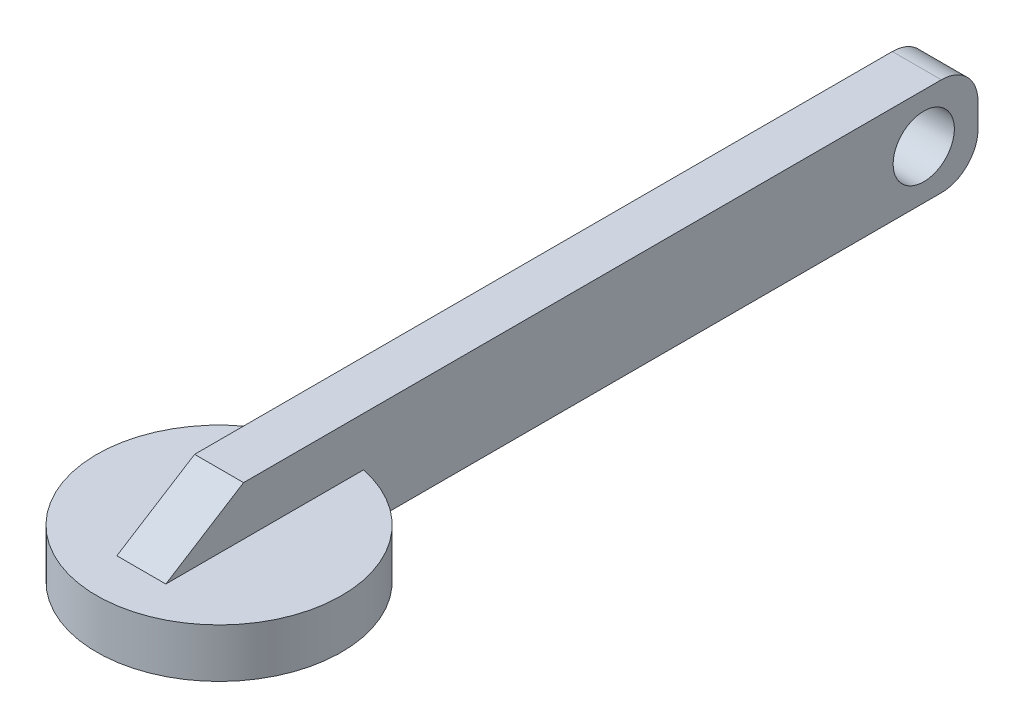
ISO-10303-21;
HEADER;
FILE_DESCRIPTION(('STEP AP214'),'2;1');
FILE_NAME('part.step','',(''),(''),'','','');
FILE_SCHEMA(('AUTOMOTIVE_DESIGN { 1 0 10303 214 1 1 1 1 }'));
ENDSEC;
DATA;
#1=APPLICATION_CONTEXT('core data for automotive mechanical design processes');
#2=APPLICATION_PROTOCOL_DEFINITION('international standard','automotive_design',2000,#1);
#3=PRODUCT_CONTEXT('',#1,'mechanical');
#4=PRODUCT('Part','Part','',(#3));
#5=PRODUCT_RELATED_PRODUCT_CATEGORY('part','',(#4));
#6=PRODUCT_DEFINITION_FORMATION('','',#4);
#7=PRODUCT_DEFINITION_CONTEXT('part definition',#1,'design');
#8=PRODUCT_DEFINITION('design','',#6,#7);
#9=PRODUCT_DEFINITION_SHAPE('','',#8);
#10=(LENGTH_UNIT() NAMED_UNIT(*) SI_UNIT(.MILLI.,.METRE.));
#11=(NAMED_UNIT(*) PLANE_ANGLE_UNIT() SI_UNIT($,.RADIAN.));
#12=(NAMED_UNIT(*) SI_UNIT($,.STERADIAN.) SOLID_ANGLE_UNIT());
#13=UNCERTAINTY_MEASURE_WITH_UNIT(LENGTH_MEASURE(1.E-05),#10,'distance_accuracy_value','');
#14=(GEOMETRIC_REPRESENTATION_CONTEXT(3) GLOBAL_UNCERTAINTY_ASSIGNED_CONTEXT((#13)) GLOBAL_UNIT_ASSIGNED_CONTEXT((#10,
#11,#12)) REPRESENTATION_CONTEXT('',''));
#15=CARTESIAN_POINT('',(0.,0.,0.));
#16=DIRECTION('',(0.,0.,1.));
#17=DIRECTION('',(1.,0.,0.));
#18=AXIS2_PLACEMENT_3D('',#15,#16,#17);
#19=CARTESIAN_POINT('',(2.,8.,30.));
#20=DIRECTION('',(-1.,0.,0.));
#21=DIRECTION('',(0.,0.,1.));
#22=AXIS2_PLACEMENT_3D('',#19,#20,#21);
#23=PLANE('',#22);
#24=CARTESIAN_POINT('',(2.,4.,-25.5675863562601));
#25=DIRECTION('',(-1.,0.,0.));
#26=DIRECTION('',(0.,0.,1.));
#27=AXIS2_PLACEMENT_3D('',#24,#25,#26);
#28=CIRCLE('',#27,2.5);
#29=CARTESIAN_POINT('',(2.,4.,-23.0675863562601));
#30=VERTEX_POINT('',#29);
#31=EDGE_CURVE('E139',#30,#30,#28,.T.);
#32=ORIENTED_EDGE('',*,*,#31,.T.);
#33=EDGE_LOOP('',(#32));
#34=FACE_BOUND('',#33,.T.);
#35=DIRECTION('',(0.,0.,1.));
#36=VECTOR('',#35,1.);
#37=CARTESIAN_POINT('',(2.,4.,30.));
#38=LINE('',#37,#36);
#39=CARTESIAN_POINT('',(2.,4.,20.2020410288673));
#40=VERTEX_POINT('',#39);
#41=CARTESIAN_POINT('',(2.,4.,36.3517218887459));
#42=VERTEX_POINT('',#41);
#43=EDGE_CURVE('E55',#40,#42,#38,.T.);
#44=ORIENTED_EDGE('',*,*,#43,.F.);
#45=DIRECTION('',(0.,-1.,0.));
#46=VECTOR('',#45,1.);
#47=CARTESIAN_POINT('',(2.,4.,20.2020410288673));
#48=LINE('',#47,#46);
#49=CARTESIAN_POINT('',(2.,0.,20.2020410288673));
#50=VERTEX_POINT('',#49);
#51=EDGE_CURVE('E132',#40,#50,#48,.T.);
#52=ORIENTED_EDGE('',*,*,#51,.T.);
#53=DIRECTION('',(0.,0.,-1.));
#54=VECTOR('',#53,1.);
#55=CARTESIAN_POINT('',(2.,0.,30.));
#56=LINE('',#55,#54);
#57=CARTESIAN_POINT('',(2.,0.,-27.));
#58=VERTEX_POINT('',#57);
#59=EDGE_CURVE('E142',#50,#58,#56,.T.);
#60=ORIENTED_EDGE('',*,*,#59,.T.);
#61=CARTESIAN_POINT('',(2.,3.,-27.));
#62=DIRECTION('',(-1.,0.,0.));
#63=DIRECTION('',(0.,0.,1.));
#64=AXIS2_PLACEMENT_3D('',#61,#62,#63);
#65=CIRCLE('',#64,3.);
#66=CARTESIAN_POINT('',(2.,3.,-30.));
#67=VERTEX_POINT('',#66);
#68=EDGE_CURVE('E162',#58,#67,#65,.F.);
#69=ORIENTED_EDGE('',*,*,#68,.T.);
#70=DIRECTION('',(0.,-1.,0.));
#71=VECTOR('',#70,1.);
#72=CARTESIAN_POINT('',(2.,8.,-30.));
#73=LINE('',#72,#71);
#74=CARTESIAN_POINT('',(2.,5.,-30.));
#75=VERTEX_POINT('',#74);
#76=EDGE_CURVE('E149',#75,#67,#73,.T.);
#77=ORIENTED_EDGE('',*,*,#76,.F.);
#78=CARTESIAN_POINT('',(2.,5.,-27.));
#79=DIRECTION('',(-1.,0.,0.));
#80=DIRECTION('',(0.,0.,1.));
#81=AXIS2_PLACEMENT_3D('',#78,#79,#80);
#82=CIRCLE('',#81,3.);
#83=CARTESIAN_POINT('',(2.,8.,-27.));
#84=VERTEX_POINT('',#83);
#85=EDGE_CURVE('E41',#75,#84,#82,.F.);
#86=ORIENTED_EDGE('',*,*,#85,.T.);
#87=DIRECTION('',(0.,0.,-1.));
#88=VECTOR('',#87,1.);
#89=CARTESIAN_POINT('',(2.,8.,30.));
#90=LINE('',#89,#88);
#91=CARTESIAN_POINT('',(2.,8.,30.));
#92=VERTEX_POINT('',#91);
#93=EDGE_CURVE('E107',#92,#84,#90,.T.);
#94=ORIENTED_EDGE('',*,*,#93,.F.);
#95=DIRECTION('',(0.,-0.532886507270041,0.84618672311112));
#96=VECTOR('',#95,1.);
#97=CARTESIAN_POINT('',(2.,4.,36.3517218887459));
#98=LINE('',#97,#96);
#99=EDGE_CURVE('E115',#92,#42,#98,.T.);
#100=ORIENTED_EDGE('',*,*,#99,.T.);
#101=EDGE_LOOP('',(#44,#52,#60,#69,#77,#86,#94,#100));
#102=FACE_BOUND('',#101,.T.);
#103=ADVANCED_FACE('F33',(#34,#102),#23,.F.);
#104=CARTESIAN_POINT('',(-2.,8.,-30.));
#105=DIRECTION('',(0.,0.,1.));
#106=DIRECTION('',(1.,0.,0.));
#107=AXIS2_PLACEMENT_3D('',#104,#105,#106);
#108=PLANE('',#107);
#109=DIRECTION('',(0.,-1.,0.));
#110=VECTOR('',#109,1.);
#111=CARTESIAN_POINT('',(-2.,8.,-30.));
#112=LINE('',#111,#110);
#113=CARTESIAN_POINT('',(-2.,5.,-30.));
#114=VERTEX_POINT('',#113);
#115=CARTESIAN_POINT('',(-2.,3.,-30.));
#116=VERTEX_POINT('',#115);
#117=EDGE_CURVE('E116',#114,#116,#112,.T.);
#118=ORIENTED_EDGE('',*,*,#117,.F.);
#119=DIRECTION('',(-1.,0.,0.));
#120=VECTOR('',#119,1.);
#121=CARTESIAN_POINT('',(-2.,5.,-30.));
#122=LINE('',#121,#120);
#123=EDGE_CURVE('E160',#114,#75,#122,.F.);
#124=ORIENTED_EDGE('',*,*,#123,.T.);
#125=ORIENTED_EDGE('',*,*,#76,.T.);
#126=DIRECTION('',(-1.,0.,0.));
#127=VECTOR('',#126,1.);
#128=CARTESIAN_POINT('',(-2.,3.,-30.));
#129=LINE('',#128,#127);
#130=EDGE_CURVE('E157',#67,#116,#129,.T.);
#131=ORIENTED_EDGE('',*,*,#130,.T.);
#132=EDGE_LOOP('',(#118,#124,#125,#131));
#133=FACE_BOUND('',#132,.T.);
#134=ADVANCED_FACE('F171',(#133),#108,.F.);
#135=CARTESIAN_POINT('',(-2.,8.,30.));
#136=DIRECTION('',(1.,0.,0.));
#137=DIRECTION('',(0.,0.,-1.));
#138=AXIS2_PLACEMENT_3D('',#135,#136,#137);
#139=PLANE('',#138);
#140=CARTESIAN_POINT('',(-2.,4.,-25.5675863562601));
#141=DIRECTION('',(-1.,0.,0.));
#142=DIRECTION('',(0.,0.,1.));
#143=AXIS2_PLACEMENT_3D('',#140,#141,#142);
#144=CIRCLE('',#143,2.5);
#145=CARTESIAN_POINT('',(-2.,4.,-23.0675863562601));
#146=VERTEX_POINT('',#145);
#147=EDGE_CURVE('E136',#146,#146,#144,.T.);
#148=ORIENTED_EDGE('',*,*,#147,.F.);
#149=EDGE_LOOP('',(#148));
#150=FACE_BOUND('',#149,.T.);
#151=DIRECTION('',(0.,0.,1.));
#152=VECTOR('',#151,1.);
#153=CARTESIAN_POINT('',(-2.,0.,30.));
#154=LINE('',#153,#152);
#155=CARTESIAN_POINT('',(-2.,0.,-27.));
#156=VERTEX_POINT('',#155);
#157=CARTESIAN_POINT('',(-2.,0.,20.2020410288673));
#158=VERTEX_POINT('',#157);
#159=EDGE_CURVE('E143',#156,#158,#154,.T.);
#160=ORIENTED_EDGE('',*,*,#159,.T.);
#161=DIRECTION('',(0.,-1.,0.));
#162=VECTOR('',#161,1.);
#163=CARTESIAN_POINT('',(-2.,4.,20.2020410288673));
#164=LINE('',#163,#162);
#165=CARTESIAN_POINT('',(-2.,4.,20.2020410288673));
#166=VERTEX_POINT('',#165);
#167=EDGE_CURVE('E128',#158,#166,#164,.F.);
#168=ORIENTED_EDGE('',*,*,#167,.T.);
#169=DIRECTION('',(0.,0.,-1.));
#170=VECTOR('',#169,1.);
#171=CARTESIAN_POINT('',(-2.,4.,30.));
#172=LINE('',#171,#170);
#173=CARTESIAN_POINT('',(-2.,4.,36.3517218887459));
#174=VERTEX_POINT('',#173);
#175=EDGE_CURVE('E48',#174,#166,#172,.T.);
#176=ORIENTED_EDGE('',*,*,#175,.F.);
#177=DIRECTION('',(0.,-0.532886507270041,0.84618672311112));
#178=VECTOR('',#177,1.);
#179=CARTESIAN_POINT('',(-2.,4.,36.3517218887459));
#180=LINE('',#179,#178);
#181=CARTESIAN_POINT('',(-2.,8.,30.));
#182=VERTEX_POINT('',#181);
#183=EDGE_CURVE('E113',#182,#174,#180,.T.);
#184=ORIENTED_EDGE('',*,*,#183,.F.);
#185=DIRECTION('',(0.,0.,1.));
#186=VECTOR('',#185,1.);
#187=CARTESIAN_POINT('',(-2.,8.,30.));
#188=LINE('',#187,#186);
#189=CARTESIAN_POINT('',(-2.,8.,-27.));
#190=VERTEX_POINT('',#189);
#191=EDGE_CURVE('E99',#190,#182,#188,.T.);
#192=ORIENTED_EDGE('',*,*,#191,.F.);
#193=CARTESIAN_POINT('',(-2.,5.,-27.));
#194=DIRECTION('',(1.,0.,0.));
#195=DIRECTION('',(0.,0.,-1.));
#196=AXIS2_PLACEMENT_3D('',#193,#194,#195);
#197=CIRCLE('',#196,3.);
#198=EDGE_CURVE('E155',#190,#114,#197,.F.);
#199=ORIENTED_EDGE('',*,*,#198,.T.);
#200=ORIENTED_EDGE('',*,*,#117,.T.);
#201=CARTESIAN_POINT('',(-2.,3.,-27.));
#202=DIRECTION('',(1.,0.,0.));
#203=DIRECTION('',(0.,0.,-1.));
#204=AXIS2_PLACEMENT_3D('',#201,#202,#203);
#205=CIRCLE('',#204,3.);
#206=EDGE_CURVE('E153',#116,#156,#205,.F.);
#207=ORIENTED_EDGE('',*,*,#206,.T.);
#208=EDGE_LOOP('',(#160,#168,#176,#184,#192,#199,#200,#207));
#209=FACE_BOUND('',#208,.T.);
#210=ADVANCED_FACE('F118',(#150,#209),#139,.F.);
#211=CARTESIAN_POINT('',(0.,8.,0.));
#212=DIRECTION('',(0.,-1.,0.));
#213=DIRECTION('',(0.,0.,-1.));
#214=AXIS2_PLACEMENT_3D('',#211,#212,#213);
#215=PLANE('',#214);
#216=ORIENTED_EDGE('',*,*,#93,.T.);
#217=DIRECTION('',(-1.,0.,0.));
#218=VECTOR('',#217,1.);
#219=CARTESIAN_POINT('',(0.,8.,-27.));
#220=LINE('',#219,#218);
#221=EDGE_CURVE('E106',#84,#190,#220,.T.);
#222=ORIENTED_EDGE('',*,*,#221,.T.);
#223=ORIENTED_EDGE('',*,*,#191,.T.);
#224=DIRECTION('',(1.,0.,0.));
#225=VECTOR('',#224,1.);
#226=CARTESIAN_POINT('',(-2.,8.,30.));
#227=LINE('',#226,#225);
#228=EDGE_CURVE('E103',#182,#92,#227,.T.);
#229=ORIENTED_EDGE('',*,*,#228,.T.);
#230=EDGE_LOOP('',(#216,#222,#223,#229));
#231=FACE_BOUND('',#230,.T.);
#232=ADVANCED_FACE('F102',(#231),#215,.F.);
#233=CARTESIAN_POINT('',(0.,0.,0.));
#234=DIRECTION('',(0.,-1.,0.));
#235=DIRECTION('',(0.,0.,-1.));
#236=AXIS2_PLACEMENT_3D('',#233,#234,#235);
#237=PLANE('',#236);
#238=ORIENTED_EDGE('',*,*,#59,.F.);
#239=CARTESIAN_POINT('',(0.,0.,30.));
#240=DIRECTION('',(0.,-1.,0.));
#241=DIRECTION('',(0.,0.,-1.));
#242=AXIS2_PLACEMENT_3D('',#239,#240,#241);
#243=CIRCLE('',#242,10.);
#244=EDGE_CURVE('E121',#50,#158,#243,.T.);
#245=ORIENTED_EDGE('',*,*,#244,.T.);
#246=ORIENTED_EDGE('',*,*,#159,.F.);
#247=DIRECTION('',(-1.,0.,0.));
#248=VECTOR('',#247,1.);
#249=CARTESIAN_POINT('',(2.,0.,-27.));
#250=LINE('',#249,#248);
#251=EDGE_CURVE('E11',#156,#58,#250,.F.);
#252=ORIENTED_EDGE('',*,*,#251,.T.);
#253=EDGE_LOOP('',(#238,#245,#246,#252));
#254=FACE_BOUND('',#253,.T.);
#255=ADVANCED_FACE('F180',(#254),#237,.T.);
#256=CARTESIAN_POINT('',(6.,4.,-25.5675863562601));
#257=DIRECTION('',(-1.,0.,0.));
#258=DIRECTION('',(0.,0.,1.));
#259=AXIS2_PLACEMENT_3D('',#256,#257,#258);
#260=CYLINDRICAL_SURFACE('',#259,2.5);
#261=ORIENTED_EDGE('',*,*,#147,.T.);
#262=EDGE_LOOP('',(#261));
#263=FACE_BOUND('',#262,.T.);
#264=ORIENTED_EDGE('',*,*,#31,.F.);
#265=EDGE_LOOP('',(#264));
#266=FACE_BOUND('',#265,.T.);
#267=ADVANCED_FACE('F203',(#263,#266),#260,.F.);
#268=CARTESIAN_POINT('',(0.,5.,-27.));
#269=DIRECTION('',(-1.,0.,0.));
#270=DIRECTION('',(0.,0.,1.));
#271=AXIS2_PLACEMENT_3D('',#268,#269,#270);
#272=CYLINDRICAL_SURFACE('',#271,3.);
#273=ORIENTED_EDGE('',*,*,#85,.F.);
#274=ORIENTED_EDGE('',*,*,#123,.F.);
#275=ORIENTED_EDGE('',*,*,#198,.F.);
#276=ORIENTED_EDGE('',*,*,#221,.F.);
#277=EDGE_LOOP('',(#273,#274,#275,#276));
#278=FACE_BOUND('',#277,.T.);
#279=ADVANCED_FACE('F168',(#278),#272,.T.);
#280=CARTESIAN_POINT('',(-2.,3.,-27.));
#281=DIRECTION('',(1.,0.,0.));
#282=DIRECTION('',(0.,0.,-1.));
#283=AXIS2_PLACEMENT_3D('',#280,#281,#282);
#284=CYLINDRICAL_SURFACE('',#283,3.);
#285=ORIENTED_EDGE('',*,*,#68,.F.);
#286=ORIENTED_EDGE('',*,*,#251,.F.);
#287=ORIENTED_EDGE('',*,*,#206,.F.);
#288=ORIENTED_EDGE('',*,*,#130,.F.);
#289=EDGE_LOOP('',(#285,#286,#287,#288));
#290=FACE_BOUND('',#289,.T.);
#291=ADVANCED_FACE('F35',(#290),#284,.T.);
#292=CARTESIAN_POINT('',(0.,4.,30.));
#293=DIRECTION('',(0.,-1.,0.));
#294=DIRECTION('',(0.,0.,-1.));
#295=AXIS2_PLACEMENT_3D('',#292,#293,#294);
#296=PLANE('',#295);
#297=DIRECTION('',(1.,0.,0.));
#298=VECTOR('',#297,1.);
#299=CARTESIAN_POINT('',(-2.,4.,36.3517218887459));
#300=LINE('',#299,#298);
#301=EDGE_CURVE('E119',#174,#42,#300,.T.);
#302=ORIENTED_EDGE('',*,*,#301,.F.);
#303=ORIENTED_EDGE('',*,*,#175,.T.);
#304=CARTESIAN_POINT('',(0.,4.,30.));
#305=DIRECTION('',(0.,-1.,0.));
#306=DIRECTION('',(0.,0.,-1.));
#307=AXIS2_PLACEMENT_3D('',#304,#305,#306);
#308=CIRCLE('',#307,10.);
#309=EDGE_CURVE('E125',#40,#166,#308,.T.);
#310=ORIENTED_EDGE('',*,*,#309,.F.);
#311=ORIENTED_EDGE('',*,*,#43,.T.);
#312=EDGE_LOOP('',(#302,#303,#310,#311));
#313=FACE_BOUND('',#312,.T.);
#314=ADVANCED_FACE('F185',(#313),#296,.F.);
#315=CARTESIAN_POINT('',(0.,4.,30.));
#316=DIRECTION('',(0.,-1.,0.));
#317=DIRECTION('',(0.,0.,-1.));
#318=AXIS2_PLACEMENT_3D('',#315,#316,#317);
#319=CYLINDRICAL_SURFACE('',#318,10.);
#320=ORIENTED_EDGE('',*,*,#51,.F.);
#321=ORIENTED_EDGE('',*,*,#309,.T.);
#322=ORIENTED_EDGE('',*,*,#167,.F.);
#323=ORIENTED_EDGE('',*,*,#244,.F.);
#324=EDGE_LOOP('',(#320,#321,#322,#323));
#325=FACE_BOUND('',#324,.T.);
#326=ADVANCED_FACE('F184',(#325),#319,.T.);
#327=CARTESIAN_POINT('',(-2.,4.,36.3517218887459));
#328=DIRECTION('',(0.,0.84618672311112,0.532886507270041));
#329=DIRECTION('',(0.,-0.532886507270041,0.84618672311112));
#330=AXIS2_PLACEMENT_3D('',#327,#328,#329);
#331=PLANE('',#330);
#332=ORIENTED_EDGE('',*,*,#99,.F.);
#333=ORIENTED_EDGE('',*,*,#228,.F.);
#334=ORIENTED_EDGE('',*,*,#183,.T.);
#335=ORIENTED_EDGE('',*,*,#301,.T.);
#336=EDGE_LOOP('',(#332,#333,#334,#335));
#337=FACE_BOUND('',#336,.T.);
#338=ADVANCED_FACE('F112',(#337),#331,.T.);
#339=CLOSED_SHELL('',(#103,#134,#210,#232,#255,#267,#279,#291,#314,#326,#338));
#340=MANIFOLD_SOLID_BREP('B2',#339);
#341=ADVANCED_BREP_SHAPE_REPRESENTATION('',(#18,#340),#14);
#342=SHAPE_DEFINITION_REPRESENTATION(#9,#341);
ENDSEC;
END-ISO-10303-21;
